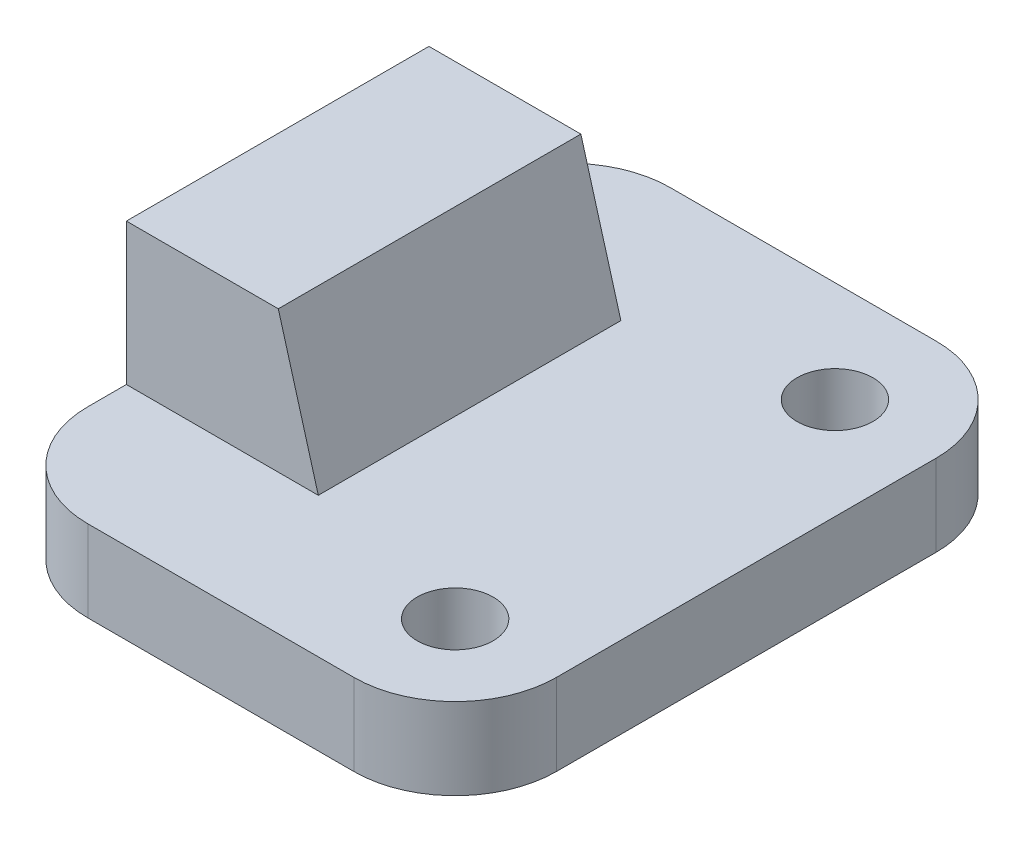
ISO-10303-21;
HEADER;
FILE_DESCRIPTION(('STEP AP214'),'2;1');
FILE_NAME('part.step','',(''),(''),'','','');
FILE_SCHEMA(('AUTOMOTIVE_DESIGN { 1 0 10303 214 1 1 1 1 }'));
ENDSEC;
DATA;
#1=APPLICATION_CONTEXT('core data for automotive mechanical design processes');
#2=APPLICATION_PROTOCOL_DEFINITION('international standard','automotive_design',2000,#1);
#3=PRODUCT_CONTEXT('',#1,'mechanical');
#4=PRODUCT('Part','Part','',(#3));
#5=PRODUCT_RELATED_PRODUCT_CATEGORY('part','',(#4));
#6=PRODUCT_DEFINITION_FORMATION('','',#4);
#7=PRODUCT_DEFINITION_CONTEXT('part definition',#1,'design');
#8=PRODUCT_DEFINITION('design','',#6,#7);
#9=PRODUCT_DEFINITION_SHAPE('','',#8);
#10=(LENGTH_UNIT() NAMED_UNIT(*) SI_UNIT(.MILLI.,.METRE.));
#11=(NAMED_UNIT(*) PLANE_ANGLE_UNIT() SI_UNIT($,.RADIAN.));
#12=(NAMED_UNIT(*) SI_UNIT($,.STERADIAN.) SOLID_ANGLE_UNIT());
#13=UNCERTAINTY_MEASURE_WITH_UNIT(LENGTH_MEASURE(1.E-05),#10,'distance_accuracy_value','');
#14=(GEOMETRIC_REPRESENTATION_CONTEXT(3) GLOBAL_UNCERTAINTY_ASSIGNED_CONTEXT((#13)) GLOBAL_UNIT_ASSIGNED_CONTEXT((#10,
#11,#12)) REPRESENTATION_CONTEXT('',''));
#15=CARTESIAN_POINT('',(0.,0.,0.));
#16=DIRECTION('',(0.,0.,1.));
#17=DIRECTION('',(1.,0.,0.));
#18=AXIS2_PLACEMENT_3D('',#15,#16,#17);
#19=CARTESIAN_POINT('',(4.,3.22,-19.));
#20=DIRECTION('',(0.,1.,0.));
#21=DIRECTION('',(0.,0.,1.));
#22=AXIS2_PLACEMENT_3D('',#19,#20,#21);
#23=PLANE('',#22);
#24=CARTESIAN_POINT('',(14.51,3.22,-19.));
#25=DIRECTION('',(0.,1.,0.));
#26=DIRECTION('',(0.,0.,1.));
#27=AXIS2_PLACEMENT_3D('',#24,#25,#26);
#28=CIRCLE('',#27,1.5);
#29=CARTESIAN_POINT('',(14.51,3.22,-20.5));
#30=VERTEX_POINT('',#29);
#31=EDGE_CURVE('E188',#30,#30,#28,.T.);
#32=ORIENTED_EDGE('',*,*,#31,.F.);
#33=EDGE_LOOP('',(#32));
#34=FACE_BOUND('',#33,.T.);
#35=CARTESIAN_POINT('',(14.51,3.22,-4.));
#36=DIRECTION('',(0.,1.,0.));
#37=DIRECTION('',(0.,0.,1.));
#38=AXIS2_PLACEMENT_3D('',#35,#36,#37);
#39=CIRCLE('',#38,1.5);
#40=CARTESIAN_POINT('',(14.51,3.22,-5.5));
#41=VERTEX_POINT('',#40);
#42=EDGE_CURVE('E180',#41,#41,#39,.T.);
#43=ORIENTED_EDGE('',*,*,#42,.F.);
#44=EDGE_LOOP('',(#43));
#45=FACE_BOUND('',#44,.T.);
#46=DIRECTION('',(-1.,0.,0.));
#47=VECTOR('',#46,1.);
#48=CARTESIAN_POINT('',(6.,3.22,-17.475));
#49=LINE('',#48,#47);
#50=CARTESIAN_POINT('',(7.58,3.22,-17.475));
#51=VERTEX_POINT('',#50);
#52=CARTESIAN_POINT('',(0.,3.22,-17.475));
#53=VERTEX_POINT('',#52);
#54=EDGE_CURVE('E132',#51,#53,#49,.T.);
#55=ORIENTED_EDGE('',*,*,#54,.F.);
#56=DIRECTION('',(0.,0.,1.));
#57=VECTOR('',#56,1.);
#58=CARTESIAN_POINT('',(7.58,3.22,-17.475));
#59=LINE('',#58,#57);
#60=CARTESIAN_POINT('',(7.58,3.22,-5.525));
#61=VERTEX_POINT('',#60);
#62=EDGE_CURVE('E134',#51,#61,#59,.T.);
#63=ORIENTED_EDGE('',*,*,#62,.T.);
#64=DIRECTION('',(1.,0.,0.));
#65=VECTOR('',#64,1.);
#66=CARTESIAN_POINT('',(0.,3.22,-5.525));
#67=LINE('',#66,#65);
#68=CARTESIAN_POINT('',(0.,3.22,-5.525));
#69=VERTEX_POINT('',#68);
#70=EDGE_CURVE('E61',#69,#61,#67,.T.);
#71=ORIENTED_EDGE('',*,*,#70,.F.);
#72=DIRECTION('',(0.,0.,1.));
#73=VECTOR('',#72,1.);
#74=CARTESIAN_POINT('',(0.,3.22,-19.));
#75=LINE('',#74,#73);
#76=CARTESIAN_POINT('',(0.,3.22,-4.00000000000003));
#77=VERTEX_POINT('',#76);
#78=EDGE_CURVE('E199',#69,#77,#75,.T.);
#79=ORIENTED_EDGE('',*,*,#78,.T.);
#80=CARTESIAN_POINT('',(4.,3.22,-4.));
#81=DIRECTION('',(0.,1.,0.));
#82=DIRECTION('',(0.,0.,-1.));
#83=AXIS2_PLACEMENT_3D('',#80,#81,#82);
#84=CIRCLE('',#83,4.);
#85=CARTESIAN_POINT('',(4.00000000000003,3.22,0.));
#86=VERTEX_POINT('',#85);
#87=EDGE_CURVE('E203',#77,#86,#84,.T.);
#88=ORIENTED_EDGE('',*,*,#87,.T.);
#89=DIRECTION('',(1.,0.,0.));
#90=VECTOR('',#89,1.);
#91=CARTESIAN_POINT('',(4.00000000000003,3.22,0.));
#92=LINE('',#91,#90);
#93=CARTESIAN_POINT('',(14.51,3.22,0.));
#94=VERTEX_POINT('',#93);
#95=EDGE_CURVE('E206',#86,#94,#92,.T.);
#96=ORIENTED_EDGE('',*,*,#95,.T.);
#97=CARTESIAN_POINT('',(14.51,3.22,-4.));
#98=DIRECTION('',(0.,1.,0.));
#99=DIRECTION('',(0.,0.,1.));
#100=AXIS2_PLACEMENT_3D('',#97,#98,#99);
#101=CIRCLE('',#100,4.);
#102=CARTESIAN_POINT('',(18.51,3.22,-4.00000000000003));
#103=VERTEX_POINT('',#102);
#104=EDGE_CURVE('E209',#94,#103,#101,.T.);
#105=ORIENTED_EDGE('',*,*,#104,.T.);
#106=DIRECTION('',(0.,0.,-1.));
#107=VECTOR('',#106,1.);
#108=CARTESIAN_POINT('',(18.51,3.22,-4.00000000000003));
#109=LINE('',#108,#107);
#110=CARTESIAN_POINT('',(18.51,3.22,-19.));
#111=VERTEX_POINT('',#110);
#112=EDGE_CURVE('E212',#103,#111,#109,.T.);
#113=ORIENTED_EDGE('',*,*,#112,.T.);
#114=CARTESIAN_POINT('',(14.51,3.22,-19.));
#115=DIRECTION('',(0.,1.,0.));
#116=DIRECTION('',(0.,0.,1.));
#117=AXIS2_PLACEMENT_3D('',#114,#115,#116);
#118=CIRCLE('',#117,4.);
#119=CARTESIAN_POINT('',(14.51,3.22,-23.));
#120=VERTEX_POINT('',#119);
#121=EDGE_CURVE('E215',#111,#120,#118,.T.);
#122=ORIENTED_EDGE('',*,*,#121,.T.);
#123=DIRECTION('',(-1.,0.,0.));
#124=VECTOR('',#123,1.);
#125=CARTESIAN_POINT('',(14.51,3.22,-23.));
#126=LINE('',#125,#124);
#127=CARTESIAN_POINT('',(4.00000000000003,3.22,-23.));
#128=VERTEX_POINT('',#127);
#129=EDGE_CURVE('E218',#120,#128,#126,.T.);
#130=ORIENTED_EDGE('',*,*,#129,.T.);
#131=CARTESIAN_POINT('',(4.,3.22,-19.));
#132=DIRECTION('',(0.,1.,0.));
#133=DIRECTION('',(0.,0.,1.));
#134=AXIS2_PLACEMENT_3D('',#131,#132,#133);
#135=CIRCLE('',#134,4.);
#136=CARTESIAN_POINT('',(0.,3.22,-19.));
#137=VERTEX_POINT('',#136);
#138=EDGE_CURVE('E196',#128,#137,#135,.T.);
#139=ORIENTED_EDGE('',*,*,#138,.T.);
#140=EDGE_CURVE('E68',#137,#53,#75,.T.);
#141=ORIENTED_EDGE('',*,*,#140,.T.);
#142=EDGE_LOOP('',(#55,#63,#71,#79,#88,#96,#105,#113,#122,#130,#139,#141));
#143=FACE_BOUND('',#142,.T.);
#144=ADVANCED_FACE('F45',(#34,#45,#143),#23,.T.);
#145=CARTESIAN_POINT('',(4.,0.,-19.));
#146=DIRECTION('',(0.,1.,0.));
#147=DIRECTION('',(0.,0.,1.));
#148=AXIS2_PLACEMENT_3D('',#145,#146,#147);
#149=PLANE('',#148);
#150=CARTESIAN_POINT('',(4.,0.,-19.));
#151=DIRECTION('',(0.,1.,0.));
#152=DIRECTION('',(0.,0.,1.));
#153=AXIS2_PLACEMENT_3D('',#150,#151,#152);
#154=CIRCLE('',#153,4.);
#155=CARTESIAN_POINT('',(4.00000000000003,0.,-23.));
#156=VERTEX_POINT('',#155);
#157=CARTESIAN_POINT('',(0.,0.,-19.));
#158=VERTEX_POINT('',#157);
#159=EDGE_CURVE('E192',#156,#158,#154,.T.);
#160=ORIENTED_EDGE('',*,*,#159,.F.);
#161=DIRECTION('',(-1.,0.,0.));
#162=VECTOR('',#161,1.);
#163=CARTESIAN_POINT('',(14.51,0.,-23.));
#164=LINE('',#163,#162);
#165=CARTESIAN_POINT('',(14.51,0.,-23.));
#166=VERTEX_POINT('',#165);
#167=EDGE_CURVE('E200',#166,#156,#164,.T.);
#168=ORIENTED_EDGE('',*,*,#167,.F.);
#169=CARTESIAN_POINT('',(14.51,0.,-19.));
#170=DIRECTION('',(0.,1.,0.));
#171=DIRECTION('',(0.,0.,1.));
#172=AXIS2_PLACEMENT_3D('',#169,#170,#171);
#173=CIRCLE('',#172,4.);
#174=CARTESIAN_POINT('',(18.51,0.,-19.));
#175=VERTEX_POINT('',#174);
#176=EDGE_CURVE('E240',#175,#166,#173,.T.);
#177=ORIENTED_EDGE('',*,*,#176,.F.);
#178=DIRECTION('',(0.,0.,-1.));
#179=VECTOR('',#178,1.);
#180=CARTESIAN_POINT('',(18.51,0.,-4.00000000000003));
#181=LINE('',#180,#179);
#182=CARTESIAN_POINT('',(18.51,0.,-4.00000000000003));
#183=VERTEX_POINT('',#182);
#184=EDGE_CURVE('E237',#183,#175,#181,.T.);
#185=ORIENTED_EDGE('',*,*,#184,.F.);
#186=CARTESIAN_POINT('',(14.51,0.,-4.));
#187=DIRECTION('',(0.,1.,0.));
#188=DIRECTION('',(0.,0.,1.));
#189=AXIS2_PLACEMENT_3D('',#186,#187,#188);
#190=CIRCLE('',#189,4.);
#191=CARTESIAN_POINT('',(14.51,0.,0.));
#192=VERTEX_POINT('',#191);
#193=EDGE_CURVE('E234',#192,#183,#190,.T.);
#194=ORIENTED_EDGE('',*,*,#193,.F.);
#195=DIRECTION('',(1.,0.,0.));
#196=VECTOR('',#195,1.);
#197=CARTESIAN_POINT('',(4.00000000000003,0.,0.));
#198=LINE('',#197,#196);
#199=CARTESIAN_POINT('',(4.00000000000003,0.,0.));
#200=VERTEX_POINT('',#199);
#201=EDGE_CURVE('E231',#200,#192,#198,.T.);
#202=ORIENTED_EDGE('',*,*,#201,.F.);
#203=CARTESIAN_POINT('',(4.,0.,-4.));
#204=DIRECTION('',(0.,1.,0.));
#205=DIRECTION('',(0.,0.,-1.));
#206=AXIS2_PLACEMENT_3D('',#203,#204,#205);
#207=CIRCLE('',#206,4.);
#208=CARTESIAN_POINT('',(0.,0.,-4.00000000000003));
#209=VERTEX_POINT('',#208);
#210=EDGE_CURVE('E228',#209,#200,#207,.T.);
#211=ORIENTED_EDGE('',*,*,#210,.F.);
#212=DIRECTION('',(0.,0.,1.));
#213=VECTOR('',#212,1.);
#214=CARTESIAN_POINT('',(0.,0.,-19.));
#215=LINE('',#214,#213);
#216=EDGE_CURVE('E225',#158,#209,#215,.T.);
#217=ORIENTED_EDGE('',*,*,#216,.F.);
#218=EDGE_LOOP('',(#160,#168,#177,#185,#194,#202,#211,#217));
#219=FACE_BOUND('',#218,.T.);
#220=CARTESIAN_POINT('',(14.51,0.,-19.));
#221=DIRECTION('',(0.,1.,0.));
#222=DIRECTION('',(0.,0.,1.));
#223=AXIS2_PLACEMENT_3D('',#220,#221,#222);
#224=CIRCLE('',#223,1.5);
#225=CARTESIAN_POINT('',(14.51,0.,-20.5));
#226=VERTEX_POINT('',#225);
#227=EDGE_CURVE('E184',#226,#226,#224,.T.);
#228=ORIENTED_EDGE('',*,*,#227,.T.);
#229=EDGE_LOOP('',(#228));
#230=FACE_BOUND('',#229,.T.);
#231=CARTESIAN_POINT('',(14.51,0.,-4.));
#232=DIRECTION('',(0.,1.,0.));
#233=DIRECTION('',(0.,0.,1.));
#234=AXIS2_PLACEMENT_3D('',#231,#232,#233);
#235=CIRCLE('',#234,1.5);
#236=CARTESIAN_POINT('',(14.51,0.,-5.5));
#237=VERTEX_POINT('',#236);
#238=EDGE_CURVE('E179',#237,#237,#235,.T.);
#239=ORIENTED_EDGE('',*,*,#238,.T.);
#240=EDGE_LOOP('',(#239));
#241=FACE_BOUND('',#240,.T.);
#242=ADVANCED_FACE('F279',(#219,#230,#241),#149,.F.);
#243=CARTESIAN_POINT('',(4.,3.22,-19.));
#244=DIRECTION('',(0.,-1.,0.));
#245=DIRECTION('',(0.,0.,-1.));
#246=AXIS2_PLACEMENT_3D('',#243,#244,#245);
#247=CYLINDRICAL_SURFACE('',#246,4.);
#248=ORIENTED_EDGE('',*,*,#159,.T.);
#249=DIRECTION('',(0.,-1.,0.));
#250=VECTOR('',#249,1.);
#251=CARTESIAN_POINT('',(0.,3.22,-19.));
#252=LINE('',#251,#250);
#253=EDGE_CURVE('E11',#137,#158,#252,.T.);
#254=ORIENTED_EDGE('',*,*,#253,.F.);
#255=ORIENTED_EDGE('',*,*,#138,.F.);
#256=DIRECTION('',(0.,-1.,0.));
#257=VECTOR('',#256,1.);
#258=CARTESIAN_POINT('',(4.00000000000003,3.22,-23.));
#259=LINE('',#258,#257);
#260=EDGE_CURVE('E221',#128,#156,#259,.T.);
#261=ORIENTED_EDGE('',*,*,#260,.T.);
#262=EDGE_LOOP('',(#248,#254,#255,#261));
#263=FACE_BOUND('',#262,.T.);
#264=ADVANCED_FACE('F47',(#263),#247,.T.);
#265=CARTESIAN_POINT('',(0.,3.22,-19.));
#266=DIRECTION('',(1.,0.,0.));
#267=DIRECTION('',(0.,0.,-1.));
#268=AXIS2_PLACEMENT_3D('',#265,#266,#267);
#269=PLANE('',#268);
#270=ORIENTED_EDGE('',*,*,#78,.F.);
#271=DIRECTION('',(0.,-1.,0.));
#272=VECTOR('',#271,1.);
#273=CARTESIAN_POINT('',(0.,8.81,-5.525));
#274=LINE('',#273,#272);
#275=CARTESIAN_POINT('',(0.,8.81,-5.525));
#276=VERTEX_POINT('',#275);
#277=EDGE_CURVE('E169',#276,#69,#274,.T.);
#278=ORIENTED_EDGE('',*,*,#277,.F.);
#279=DIRECTION('',(0.,0.,1.));
#280=VECTOR('',#279,1.);
#281=CARTESIAN_POINT('',(0.,8.81,-17.475));
#282=LINE('',#281,#280);
#283=CARTESIAN_POINT('',(0.,8.81,-17.475));
#284=VERTEX_POINT('',#283);
#285=EDGE_CURVE('E160',#284,#276,#282,.T.);
#286=ORIENTED_EDGE('',*,*,#285,.F.);
#287=DIRECTION('',(0.,-1.,0.));
#288=VECTOR('',#287,1.);
#289=CARTESIAN_POINT('',(0.,8.81,-17.475));
#290=LINE('',#289,#288);
#291=EDGE_CURVE('E176',#284,#53,#290,.T.);
#292=ORIENTED_EDGE('',*,*,#291,.T.);
#293=ORIENTED_EDGE('',*,*,#140,.F.);
#294=ORIENTED_EDGE('',*,*,#253,.T.);
#295=ORIENTED_EDGE('',*,*,#216,.T.);
#296=DIRECTION('',(0.,-1.,0.));
#297=VECTOR('',#296,1.);
#298=CARTESIAN_POINT('',(0.,3.22,-4.00000000000003));
#299=LINE('',#298,#297);
#300=EDGE_CURVE('E54',#77,#209,#299,.T.);
#301=ORIENTED_EDGE('',*,*,#300,.F.);
#302=EDGE_LOOP('',(#270,#278,#286,#292,#293,#294,#295,#301));
#303=FACE_BOUND('',#302,.T.);
#304=ADVANCED_FACE('F295',(#303),#269,.F.);
#305=CARTESIAN_POINT('',(4.,3.22,-4.));
#306=DIRECTION('',(0.,-1.,0.));
#307=DIRECTION('',(0.,0.,-1.));
#308=AXIS2_PLACEMENT_3D('',#305,#306,#307);
#309=CYLINDRICAL_SURFACE('',#308,4.);
#310=ORIENTED_EDGE('',*,*,#210,.T.);
#311=DIRECTION('',(0.,-1.,0.));
#312=VECTOR('',#311,1.);
#313=CARTESIAN_POINT('',(4.00000000000003,3.22,0.));
#314=LINE('',#313,#312);
#315=EDGE_CURVE('E264',#86,#200,#314,.T.);
#316=ORIENTED_EDGE('',*,*,#315,.F.);
#317=ORIENTED_EDGE('',*,*,#87,.F.);
#318=ORIENTED_EDGE('',*,*,#300,.T.);
#319=EDGE_LOOP('',(#310,#316,#317,#318));
#320=FACE_BOUND('',#319,.T.);
#321=ADVANCED_FACE('F273',(#320),#309,.T.);
#322=CARTESIAN_POINT('',(4.00000000000003,3.22,0.));
#323=DIRECTION('',(0.,0.,-1.));
#324=DIRECTION('',(-1.,0.,0.));
#325=AXIS2_PLACEMENT_3D('',#322,#323,#324);
#326=PLANE('',#325);
#327=ORIENTED_EDGE('',*,*,#201,.T.);
#328=DIRECTION('',(0.,-1.,0.));
#329=VECTOR('',#328,1.);
#330=CARTESIAN_POINT('',(14.51,3.22,0.));
#331=LINE('',#330,#329);
#332=EDGE_CURVE('E260',#94,#192,#331,.T.);
#333=ORIENTED_EDGE('',*,*,#332,.F.);
#334=ORIENTED_EDGE('',*,*,#95,.F.);
#335=ORIENTED_EDGE('',*,*,#315,.T.);
#336=EDGE_LOOP('',(#327,#333,#334,#335));
#337=FACE_BOUND('',#336,.T.);
#338=ADVANCED_FACE('F285',(#337),#326,.F.);
#339=CARTESIAN_POINT('',(14.51,3.22,-4.));
#340=DIRECTION('',(0.,-1.,0.));
#341=DIRECTION('',(0.,0.,-1.));
#342=AXIS2_PLACEMENT_3D('',#339,#340,#341);
#343=CYLINDRICAL_SURFACE('',#342,4.);
#344=ORIENTED_EDGE('',*,*,#193,.T.);
#345=DIRECTION('',(0.,-1.,0.));
#346=VECTOR('',#345,1.);
#347=CARTESIAN_POINT('',(18.51,3.22,-4.00000000000003));
#348=LINE('',#347,#346);
#349=EDGE_CURVE('E256',#103,#183,#348,.T.);
#350=ORIENTED_EDGE('',*,*,#349,.F.);
#351=ORIENTED_EDGE('',*,*,#104,.F.);
#352=ORIENTED_EDGE('',*,*,#332,.T.);
#353=EDGE_LOOP('',(#344,#350,#351,#352));
#354=FACE_BOUND('',#353,.T.);
#355=ADVANCED_FACE('F289',(#354),#343,.T.);
#356=CARTESIAN_POINT('',(18.51,3.22,-4.00000000000003));
#357=DIRECTION('',(-1.,0.,0.));
#358=DIRECTION('',(0.,0.,1.));
#359=AXIS2_PLACEMENT_3D('',#356,#357,#358);
#360=PLANE('',#359);
#361=ORIENTED_EDGE('',*,*,#184,.T.);
#362=DIRECTION('',(0.,-1.,0.));
#363=VECTOR('',#362,1.);
#364=CARTESIAN_POINT('',(18.51,3.22,-19.));
#365=LINE('',#364,#363);
#366=EDGE_CURVE('E252',#111,#175,#365,.T.);
#367=ORIENTED_EDGE('',*,*,#366,.F.);
#368=ORIENTED_EDGE('',*,*,#112,.F.);
#369=ORIENTED_EDGE('',*,*,#349,.T.);
#370=EDGE_LOOP('',(#361,#367,#368,#369));
#371=FACE_BOUND('',#370,.T.);
#372=ADVANCED_FACE('F315',(#371),#360,.F.);
#373=CARTESIAN_POINT('',(14.51,3.22,-19.));
#374=DIRECTION('',(0.,-1.,0.));
#375=DIRECTION('',(0.,0.,-1.));
#376=AXIS2_PLACEMENT_3D('',#373,#374,#375);
#377=CYLINDRICAL_SURFACE('',#376,4.);
#378=ORIENTED_EDGE('',*,*,#176,.T.);
#379=DIRECTION('',(0.,-1.,0.));
#380=VECTOR('',#379,1.);
#381=CARTESIAN_POINT('',(14.51,3.22,-23.));
#382=LINE('',#381,#380);
#383=EDGE_CURVE('E248',#120,#166,#382,.T.);
#384=ORIENTED_EDGE('',*,*,#383,.F.);
#385=ORIENTED_EDGE('',*,*,#121,.F.);
#386=ORIENTED_EDGE('',*,*,#366,.T.);
#387=EDGE_LOOP('',(#378,#384,#385,#386));
#388=FACE_BOUND('',#387,.T.);
#389=ADVANCED_FACE('F313',(#388),#377,.T.);
#390=CARTESIAN_POINT('',(14.51,3.22,-23.));
#391=DIRECTION('',(0.,0.,1.));
#392=DIRECTION('',(1.,0.,0.));
#393=AXIS2_PLACEMENT_3D('',#390,#391,#392);
#394=PLANE('',#393);
#395=ORIENTED_EDGE('',*,*,#167,.T.);
#396=ORIENTED_EDGE('',*,*,#260,.F.);
#397=ORIENTED_EDGE('',*,*,#129,.F.);
#398=ORIENTED_EDGE('',*,*,#383,.T.);
#399=EDGE_LOOP('',(#395,#396,#397,#398));
#400=FACE_BOUND('',#399,.T.);
#401=ADVANCED_FACE('F309',(#400),#394,.F.);
#402=CARTESIAN_POINT('',(14.51,3.22,-19.));
#403=DIRECTION('',(0.,-1.,0.));
#404=DIRECTION('',(0.,0.,-1.));
#405=AXIS2_PLACEMENT_3D('',#402,#403,#404);
#406=CYLINDRICAL_SURFACE('',#405,1.5);
#407=CARTESIAN_POINT('',(14.51,3.22,-20.5));
#408=CARTESIAN_POINT('',(14.51,3.18645833333333,-20.5));
#409=CARTESIAN_POINT('',(14.51,3.15291666666667,-20.5));
#410=CARTESIAN_POINT('',(14.51,3.08583333333333,-20.5));
#411=CARTESIAN_POINT('',(14.51,3.05229166666667,-20.5));
#412=CARTESIAN_POINT('',(14.51,2.98520833333333,-20.5));
#413=CARTESIAN_POINT('',(14.51,2.95166666666667,-20.5));
#414=CARTESIAN_POINT('',(14.51,2.88458333333333,-20.5));
#415=CARTESIAN_POINT('',(14.51,2.85104166666667,-20.5));
#416=CARTESIAN_POINT('',(14.51,2.78395833333333,-20.5));
#417=CARTESIAN_POINT('',(14.51,2.75041666666667,-20.5));
#418=CARTESIAN_POINT('',(14.51,2.68333333333333,-20.5));
#419=CARTESIAN_POINT('',(14.51,2.64979166666667,-20.5));
#420=CARTESIAN_POINT('',(14.51,2.58270833333333,-20.5));
#421=CARTESIAN_POINT('',(14.51,2.54916666666667,-20.5));
#422=CARTESIAN_POINT('',(14.51,2.48208333333333,-20.5));
#423=CARTESIAN_POINT('',(14.51,2.44854166666667,-20.5));
#424=CARTESIAN_POINT('',(14.51,2.38145833333333,-20.5));
#425=CARTESIAN_POINT('',(14.51,2.34791666666667,-20.5));
#426=CARTESIAN_POINT('',(14.51,2.28083333333333,-20.5));
#427=CARTESIAN_POINT('',(14.51,2.24729166666667,-20.5));
#428=CARTESIAN_POINT('',(14.51,2.18020833333333,-20.5));
#429=CARTESIAN_POINT('',(14.51,2.14666666666667,-20.5));
#430=CARTESIAN_POINT('',(14.51,2.07958333333333,-20.5));
#431=CARTESIAN_POINT('',(14.51,2.04604166666667,-20.5));
#432=CARTESIAN_POINT('',(14.51,1.97895833333333,-20.5));
#433=CARTESIAN_POINT('',(14.51,1.94541666666667,-20.5));
#434=CARTESIAN_POINT('',(14.51,1.87833333333333,-20.5));
#435=CARTESIAN_POINT('',(14.51,1.84479166666667,-20.5));
#436=CARTESIAN_POINT('',(14.51,1.77770833333333,-20.5));
#437=CARTESIAN_POINT('',(14.51,1.74416666666667,-20.5));
#438=CARTESIAN_POINT('',(14.51,1.67708333333333,-20.5));
#439=CARTESIAN_POINT('',(14.51,1.64354166666667,-20.5));
#440=CARTESIAN_POINT('',(14.51,1.57645833333333,-20.5));
#441=CARTESIAN_POINT('',(14.51,1.54291666666667,-20.5));
#442=CARTESIAN_POINT('',(14.51,1.47583333333333,-20.5));
#443=CARTESIAN_POINT('',(14.51,1.44229166666667,-20.5));
#444=CARTESIAN_POINT('',(14.51,1.37520833333333,-20.5));
#445=CARTESIAN_POINT('',(14.51,1.34166666666667,-20.5));
#446=CARTESIAN_POINT('',(14.51,1.27458333333333,-20.5));
#447=CARTESIAN_POINT('',(14.51,1.24104166666667,-20.5));
#448=CARTESIAN_POINT('',(14.51,1.17395833333333,-20.5));
#449=CARTESIAN_POINT('',(14.51,1.14041666666667,-20.5));
#450=CARTESIAN_POINT('',(14.51,1.07333333333333,-20.5));
#451=CARTESIAN_POINT('',(14.51,1.03979166666667,-20.5));
#452=CARTESIAN_POINT('',(14.51,0.972708333333334,-20.5));
#453=CARTESIAN_POINT('',(14.51,0.939166666666667,-20.5));
#454=CARTESIAN_POINT('',(14.51,0.872083333333334,-20.5));
#455=CARTESIAN_POINT('',(14.51,0.838541666666667,-20.5));
#456=CARTESIAN_POINT('',(14.51,0.771458333333333,-20.5));
#457=CARTESIAN_POINT('',(14.51,0.737916666666667,-20.5));
#458=CARTESIAN_POINT('',(14.51,0.670833333333334,-20.5));
#459=CARTESIAN_POINT('',(14.51,0.637291666666667,-20.5));
#460=CARTESIAN_POINT('',(14.51,0.570208333333333,-20.5));
#461=CARTESIAN_POINT('',(14.51,0.536666666666667,-20.5));
#462=CARTESIAN_POINT('',(14.51,0.469583333333333,-20.5));
#463=CARTESIAN_POINT('',(14.51,0.436041666666667,-20.5));
#464=CARTESIAN_POINT('',(14.51,0.368958333333333,-20.5));
#465=CARTESIAN_POINT('',(14.51,0.335416666666667,-20.5));
#466=CARTESIAN_POINT('',(14.51,0.268333333333333,-20.5));
#467=CARTESIAN_POINT('',(14.51,0.234791666666667,-20.5));
#468=CARTESIAN_POINT('',(14.51,0.167708333333333,-20.5));
#469=CARTESIAN_POINT('',(14.51,0.134166666666667,-20.5));
#470=CARTESIAN_POINT('',(14.51,0.0670833333333334,-20.5));
#471=CARTESIAN_POINT('',(14.51,0.0335416666666667,-20.5));
#472=CARTESIAN_POINT('',(14.51,0.,-20.5));
#473=B_SPLINE_CURVE_WITH_KNOTS('',3,(#407,#408,#409,#410,#411,#412,#413,#414,#415,#416,#417,
#418,#419,#420,#421,#422,#423,#424,#425,#426,#427,#428,#429,#430,#431,#432,#433,#434,#435,#436,
#437,#438,#439,#440,#441,#442,#443,#444,#445,#446,#447,#448,#449,#450,#451,#452,#453,#454,#455,
#456,#457,#458,#459,#460,#461,#462,#463,#464,#465,#466,#467,#468,#469,#470,#471,#472),
.UNSPECIFIED.,.F.,.F.,(4,2,2,2,2,2,2,2,2,2,2,2,2,2,2,2,2,2,2,2,2,2,2,2,2,2,2,2,2,2,2,2,4),(0.,
0.100625,0.20125,0.301875,0.4025,0.503125,0.60375,0.704375,0.805,0.905625,1.00625,1.106875,
1.2075,1.308125,1.40875,1.509375,1.61,1.710625,1.81125,1.911875,2.0125,2.113125,2.21375,
2.314375,2.415,2.515625,2.61625,2.716875,2.8175,2.918125,3.01875,3.119375,3.22),.UNSPECIFIED.);
#474=EDGE_CURVE('BSEAM334',#30,#226,#473,.T.);
#475=ORIENTED_EDGE('',*,*,#31,.T.);
#476=ORIENTED_EDGE('',*,*,#227,.F.);
#477=ORIENTED_EDGE('',*,*,#474,.T.);
#478=ORIENTED_EDGE('',*,*,#474,.F.);
#479=EDGE_LOOP('',(#475,#477,#476,#478));
#480=FACE_BOUND('',#479,.T.);
#481=ADVANCED_FACE('F334',(#480),#406,.F.);
#482=CARTESIAN_POINT('',(14.51,3.22,-4.));
#483=DIRECTION('',(0.,-1.,0.));
#484=DIRECTION('',(0.,0.,-1.));
#485=AXIS2_PLACEMENT_3D('',#482,#483,#484);
#486=CYLINDRICAL_SURFACE('',#485,1.5);
#487=CARTESIAN_POINT('',(14.51,3.22,-5.5));
#488=CARTESIAN_POINT('',(14.51,3.18645833333333,-5.5));
#489=CARTESIAN_POINT('',(14.51,3.15291666666667,-5.5));
#490=CARTESIAN_POINT('',(14.51,3.08583333333333,-5.5));
#491=CARTESIAN_POINT('',(14.51,3.05229166666667,-5.5));
#492=CARTESIAN_POINT('',(14.51,2.98520833333333,-5.5));
#493=CARTESIAN_POINT('',(14.51,2.95166666666667,-5.5));
#494=CARTESIAN_POINT('',(14.51,2.88458333333333,-5.5));
#495=CARTESIAN_POINT('',(14.51,2.85104166666667,-5.5));
#496=CARTESIAN_POINT('',(14.51,2.78395833333333,-5.5));
#497=CARTESIAN_POINT('',(14.51,2.75041666666667,-5.5));
#498=CARTESIAN_POINT('',(14.51,2.68333333333333,-5.5));
#499=CARTESIAN_POINT('',(14.51,2.64979166666667,-5.5));
#500=CARTESIAN_POINT('',(14.51,2.58270833333333,-5.5));
#501=CARTESIAN_POINT('',(14.51,2.54916666666667,-5.5));
#502=CARTESIAN_POINT('',(14.51,2.48208333333333,-5.5));
#503=CARTESIAN_POINT('',(14.51,2.44854166666667,-5.5));
#504=CARTESIAN_POINT('',(14.51,2.38145833333333,-5.5));
#505=CARTESIAN_POINT('',(14.51,2.34791666666667,-5.5));
#506=CARTESIAN_POINT('',(14.51,2.28083333333333,-5.5));
#507=CARTESIAN_POINT('',(14.51,2.24729166666667,-5.5));
#508=CARTESIAN_POINT('',(14.51,2.18020833333333,-5.5));
#509=CARTESIAN_POINT('',(14.51,2.14666666666667,-5.5));
#510=CARTESIAN_POINT('',(14.51,2.07958333333333,-5.5));
#511=CARTESIAN_POINT('',(14.51,2.04604166666667,-5.5));
#512=CARTESIAN_POINT('',(14.51,1.97895833333333,-5.5));
#513=CARTESIAN_POINT('',(14.51,1.94541666666667,-5.5));
#514=CARTESIAN_POINT('',(14.51,1.87833333333333,-5.5));
#515=CARTESIAN_POINT('',(14.51,1.84479166666667,-5.5));
#516=CARTESIAN_POINT('',(14.51,1.77770833333333,-5.5));
#517=CARTESIAN_POINT('',(14.51,1.74416666666667,-5.5));
#518=CARTESIAN_POINT('',(14.51,1.67708333333333,-5.5));
#519=CARTESIAN_POINT('',(14.51,1.64354166666667,-5.5));
#520=CARTESIAN_POINT('',(14.51,1.57645833333333,-5.5));
#521=CARTESIAN_POINT('',(14.51,1.54291666666667,-5.5));
#522=CARTESIAN_POINT('',(14.51,1.47583333333333,-5.5));
#523=CARTESIAN_POINT('',(14.51,1.44229166666667,-5.5));
#524=CARTESIAN_POINT('',(14.51,1.37520833333333,-5.5));
#525=CARTESIAN_POINT('',(14.51,1.34166666666667,-5.5));
#526=CARTESIAN_POINT('',(14.51,1.27458333333333,-5.5));
#527=CARTESIAN_POINT('',(14.51,1.24104166666667,-5.5));
#528=CARTESIAN_POINT('',(14.51,1.17395833333333,-5.5));
#529=CARTESIAN_POINT('',(14.51,1.14041666666667,-5.5));
#530=CARTESIAN_POINT('',(14.51,1.07333333333333,-5.5));
#531=CARTESIAN_POINT('',(14.51,1.03979166666667,-5.5));
#532=CARTESIAN_POINT('',(14.51,0.972708333333334,-5.5));
#533=CARTESIAN_POINT('',(14.51,0.939166666666667,-5.5));
#534=CARTESIAN_POINT('',(14.51,0.872083333333334,-5.5));
#535=CARTESIAN_POINT('',(14.51,0.838541666666667,-5.5));
#536=CARTESIAN_POINT('',(14.51,0.771458333333333,-5.5));
#537=CARTESIAN_POINT('',(14.51,0.737916666666667,-5.5));
#538=CARTESIAN_POINT('',(14.51,0.670833333333334,-5.5));
#539=CARTESIAN_POINT('',(14.51,0.637291666666667,-5.5));
#540=CARTESIAN_POINT('',(14.51,0.570208333333333,-5.5));
#541=CARTESIAN_POINT('',(14.51,0.536666666666667,-5.5));
#542=CARTESIAN_POINT('',(14.51,0.469583333333333,-5.5));
#543=CARTESIAN_POINT('',(14.51,0.436041666666667,-5.5));
#544=CARTESIAN_POINT('',(14.51,0.368958333333333,-5.5));
#545=CARTESIAN_POINT('',(14.51,0.335416666666667,-5.5));
#546=CARTESIAN_POINT('',(14.51,0.268333333333333,-5.5));
#547=CARTESIAN_POINT('',(14.51,0.234791666666667,-5.5));
#548=CARTESIAN_POINT('',(14.51,0.167708333333333,-5.5));
#549=CARTESIAN_POINT('',(14.51,0.134166666666667,-5.5));
#550=CARTESIAN_POINT('',(14.51,0.0670833333333334,-5.5));
#551=CARTESIAN_POINT('',(14.51,0.0335416666666667,-5.5));
#552=CARTESIAN_POINT('',(14.51,0.,-5.5));
#553=B_SPLINE_CURVE_WITH_KNOTS('',3,(#487,#488,#489,#490,#491,#492,#493,#494,#495,#496,#497,
#498,#499,#500,#501,#502,#503,#504,#505,#506,#507,#508,#509,#510,#511,#512,#513,#514,#515,#516,
#517,#518,#519,#520,#521,#522,#523,#524,#525,#526,#527,#528,#529,#530,#531,#532,#533,#534,#535,
#536,#537,#538,#539,#540,#541,#542,#543,#544,#545,#546,#547,#548,#549,#550,#551,#552),
.UNSPECIFIED.,.F.,.F.,(4,2,2,2,2,2,2,2,2,2,2,2,2,2,2,2,2,2,2,2,2,2,2,2,2,2,2,2,2,2,2,2,4),(0.,
0.100625,0.20125,0.301875,0.4025,0.503125,0.60375,0.704375,0.805,0.905625,1.00625,1.106875,
1.2075,1.308125,1.40875,1.509375,1.61,1.710625,1.81125,1.911875,2.0125,2.113125,2.21375,
2.314375,2.415,2.515625,2.61625,2.716875,2.8175,2.918125,3.01875,3.119375,3.22),.UNSPECIFIED.);
#554=EDGE_CURVE('BSEAM341',#41,#237,#553,.T.);
#555=ORIENTED_EDGE('',*,*,#42,.T.);
#556=ORIENTED_EDGE('',*,*,#238,.F.);
#557=ORIENTED_EDGE('',*,*,#554,.T.);
#558=ORIENTED_EDGE('',*,*,#554,.F.);
#559=EDGE_LOOP('',(#555,#557,#556,#558));
#560=FACE_BOUND('',#559,.T.);
#561=ADVANCED_FACE('F341',(#560),#486,.F.);
#562=CARTESIAN_POINT('',(6.,8.81,-17.475));
#563=DIRECTION('',(0.,0.,1.));
#564=DIRECTION('',(1.,0.,0.));
#565=AXIS2_PLACEMENT_3D('',#562,#563,#564);
#566=PLANE('',#565);
#567=ORIENTED_EDGE('',*,*,#54,.T.);
#568=ORIENTED_EDGE('',*,*,#291,.F.);
#569=DIRECTION('',(-1.,0.,0.));
#570=VECTOR('',#569,1.);
#571=CARTESIAN_POINT('',(6.,8.81,-17.475));
#572=LINE('',#571,#570);
#573=CARTESIAN_POINT('',(6.,8.81,-17.475));
#574=VERTEX_POINT('',#573);
#575=EDGE_CURVE('E152',#574,#284,#572,.T.);
#576=ORIENTED_EDGE('',*,*,#575,.F.);
#577=DIRECTION('',(-0.271991660386763,0.962299608583549,0.));
#578=VECTOR('',#577,1.);
#579=CARTESIAN_POINT('',(7.58,3.22,-17.475));
#580=LINE('',#579,#578);
#581=EDGE_CURVE('E143',#51,#574,#580,.T.);
#582=ORIENTED_EDGE('',*,*,#581,.F.);
#583=EDGE_LOOP('',(#567,#568,#576,#582));
#584=FACE_BOUND('',#583,.T.);
#585=ADVANCED_FACE('F150',(#584),#566,.F.);
#586=CARTESIAN_POINT('',(0.,8.81,-5.525));
#587=DIRECTION('',(0.,0.,-1.));
#588=DIRECTION('',(-1.,0.,0.));
#589=AXIS2_PLACEMENT_3D('',#586,#587,#588);
#590=PLANE('',#589);
#591=ORIENTED_EDGE('',*,*,#70,.T.);
#592=DIRECTION('',(-0.271991660386763,0.962299608583549,0.));
#593=VECTOR('',#592,1.);
#594=CARTESIAN_POINT('',(7.58,3.22,-5.525));
#595=LINE('',#594,#593);
#596=CARTESIAN_POINT('',(6.,8.81,-5.525));
#597=VERTEX_POINT('',#596);
#598=EDGE_CURVE('E146',#61,#597,#595,.T.);
#599=ORIENTED_EDGE('',*,*,#598,.T.);
#600=DIRECTION('',(1.,0.,0.));
#601=VECTOR('',#600,1.);
#602=CARTESIAN_POINT('',(0.,8.81,-5.525));
#603=LINE('',#602,#601);
#604=EDGE_CURVE('E163',#276,#597,#603,.T.);
#605=ORIENTED_EDGE('',*,*,#604,.F.);
#606=ORIENTED_EDGE('',*,*,#277,.T.);
#607=EDGE_LOOP('',(#591,#599,#605,#606));
#608=FACE_BOUND('',#607,.T.);
#609=ADVANCED_FACE('F298',(#608),#590,.F.);
#610=CARTESIAN_POINT('',(0.,8.81,0.));
#611=DIRECTION('',(0.,1.,0.));
#612=DIRECTION('',(0.,0.,1.));
#613=AXIS2_PLACEMENT_3D('',#610,#611,#612);
#614=PLANE('',#613);
#615=ORIENTED_EDGE('',*,*,#575,.T.);
#616=ORIENTED_EDGE('',*,*,#285,.T.);
#617=ORIENTED_EDGE('',*,*,#604,.T.);
#618=DIRECTION('',(0.,0.,-1.));
#619=VECTOR('',#618,1.);
#620=CARTESIAN_POINT('',(6.,8.81,-5.525));
#621=LINE('',#620,#619);
#622=EDGE_CURVE('E167',#597,#574,#621,.T.);
#623=ORIENTED_EDGE('',*,*,#622,.T.);
#624=EDGE_LOOP('',(#615,#616,#617,#623));
#625=FACE_BOUND('',#624,.T.);
#626=ADVANCED_FACE('F300',(#625),#614,.T.);
#627=CARTESIAN_POINT('',(7.58,3.22,-17.475));
#628=DIRECTION('',(0.962299608583549,0.271991660386763,0.));
#629=DIRECTION('',(-0.271991660386763,0.962299608583549,0.));
#630=AXIS2_PLACEMENT_3D('',#627,#628,#629);
#631=PLANE('',#630);
#632=ORIENTED_EDGE('',*,*,#598,.F.);
#633=ORIENTED_EDGE('',*,*,#62,.F.);
#634=ORIENTED_EDGE('',*,*,#581,.T.);
#635=ORIENTED_EDGE('',*,*,#622,.F.);
#636=EDGE_LOOP('',(#632,#633,#634,#635));
#637=FACE_BOUND('',#636,.T.);
#638=ADVANCED_FACE('F142',(#637),#631,.T.);
#639=CLOSED_SHELL('',(#144,#242,#264,#304,#321,#338,#355,#372,#389,#401,#481,#561,#585,#609,
#626,#638));
#640=MANIFOLD_SOLID_BREP('B2',#639);
#641=ADVANCED_BREP_SHAPE_REPRESENTATION('',(#18,#640),#14);
#642=SHAPE_DEFINITION_REPRESENTATION(#9,#641);
ENDSEC;
END-ISO-10303-21;
